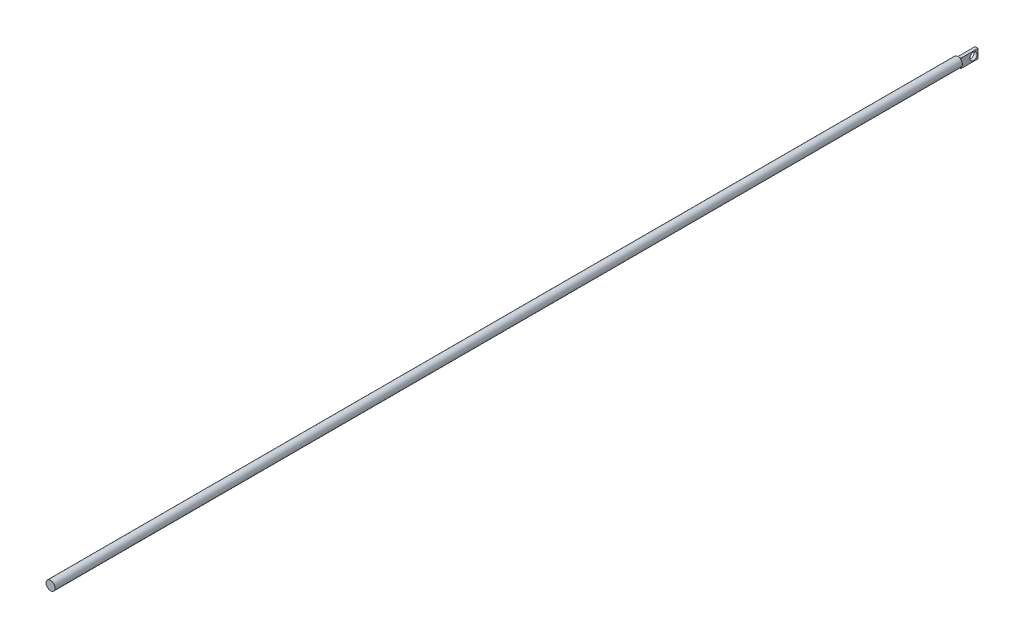
ISO-10303-21;
HEADER;
FILE_DESCRIPTION(('STEP AP214'),'2;1');
FILE_NAME('part.step','',(''),(''),'','','');
FILE_SCHEMA(('AUTOMOTIVE_DESIGN { 1 0 10303 214 1 1 1 1 }'));
ENDSEC;
DATA;
#1=APPLICATION_CONTEXT('core data for automotive mechanical design processes');
#2=APPLICATION_PROTOCOL_DEFINITION('international standard','automotive_design',2000,#1);
#3=PRODUCT_CONTEXT('',#1,'mechanical');
#4=PRODUCT('Part','Part','',(#3));
#5=PRODUCT_RELATED_PRODUCT_CATEGORY('part','',(#4));
#6=PRODUCT_DEFINITION_FORMATION('','',#4);
#7=PRODUCT_DEFINITION_CONTEXT('part definition',#1,'design');
#8=PRODUCT_DEFINITION('design','',#6,#7);
#9=PRODUCT_DEFINITION_SHAPE('','',#8);
#10=(LENGTH_UNIT() NAMED_UNIT(*) SI_UNIT(.MILLI.,.METRE.));
#11=(NAMED_UNIT(*) PLANE_ANGLE_UNIT() SI_UNIT($,.RADIAN.));
#12=(NAMED_UNIT(*) SI_UNIT($,.STERADIAN.) SOLID_ANGLE_UNIT());
#13=UNCERTAINTY_MEASURE_WITH_UNIT(LENGTH_MEASURE(1.E-05),#10,'distance_accuracy_value','');
#14=(GEOMETRIC_REPRESENTATION_CONTEXT(3) GLOBAL_UNCERTAINTY_ASSIGNED_CONTEXT((#13)) GLOBAL_UNIT_ASSIGNED_CONTEXT((#10,
#11,#12)) REPRESENTATION_CONTEXT('',''));
#15=CARTESIAN_POINT('',(0.,0.,0.));
#16=DIRECTION('',(0.,0.,1.));
#17=DIRECTION('',(1.,0.,0.));
#18=AXIS2_PLACEMENT_3D('',#15,#16,#17);
#19=CARTESIAN_POINT('',(5.,0.,0.));
#20=DIRECTION('',(1.,0.,0.));
#21=DIRECTION('',(0.,0.,-1.));
#22=AXIS2_PLACEMENT_3D('',#19,#20,#21);
#23=PLANE('',#22);
#24=DIRECTION('',(0.,-1.,0.));
#25=VECTOR('',#24,1.);
#26=CARTESIAN_POINT('',(5.,7.41500764249356,-0.050040016090637));
#27=LINE('',#26,#25);
#28=CARTESIAN_POINT('',(5.,7.41500764249356,-0.050040016090637));
#29=VERTEX_POINT('',#28);
#30=CARTESIAN_POINT('',(5.,-7.58499235750644,-0.0500400160906388));
#31=VERTEX_POINT('',#30);
#32=EDGE_CURVE('E99',#29,#31,#27,.T.);
#33=ORIENTED_EDGE('',*,*,#32,.T.);
#34=DIRECTION('',(0.,0.,-1.));
#35=VECTOR('',#34,1.);
#36=CARTESIAN_POINT('',(5.,-7.58499235750644,-0.0500400160906388));
#37=LINE('',#36,#35);
#38=CARTESIAN_POINT('',(5.,-7.58499235750644,-28.3632186152652));
#39=VERTEX_POINT('',#38);
#40=EDGE_CURVE('E94',#31,#39,#37,.T.);
#41=ORIENTED_EDGE('',*,*,#40,.T.);
#42=DIRECTION('',(0.,1.,0.));
#43=VECTOR('',#42,1.);
#44=CARTESIAN_POINT('',(5.,7.41500764249356,-28.3632186152652));
#45=LINE('',#44,#43);
#46=CARTESIAN_POINT('',(5.,7.41500764249356,-28.3632186152652));
#47=VERTEX_POINT('',#46);
#48=EDGE_CURVE('E97',#39,#47,#45,.T.);
#49=ORIENTED_EDGE('',*,*,#48,.T.);
#50=DIRECTION('',(0.,0.,1.));
#51=VECTOR('',#50,1.);
#52=CARTESIAN_POINT('',(5.,7.41500764249356,-0.050040016090637));
#53=LINE('',#52,#51);
#54=EDGE_CURVE('E64',#47,#29,#53,.T.);
#55=ORIENTED_EDGE('',*,*,#54,.T.);
#56=EDGE_LOOP('',(#33,#41,#49,#55));
#57=FACE_BOUND('',#56,.T.);
#58=CARTESIAN_POINT('',(5.,-0.289020276193807,-21.0732081841058));
#59=DIRECTION('',(1.,0.,0.));
#60=DIRECTION('',(0.,0.,-1.));
#61=AXIS2_PLACEMENT_3D('',#58,#59,#60);
#62=CIRCLE('',#61,6.);
#63=CARTESIAN_POINT('',(5.,-0.289020276193807,-27.0732081841058));
#64=VERTEX_POINT('',#63);
#65=EDGE_CURVE('E114',#64,#64,#62,.T.);
#66=ORIENTED_EDGE('',*,*,#65,.F.);
#67=EDGE_LOOP('',(#66));
#68=FACE_BOUND('',#67,.T.);
#69=ADVANCED_FACE('F47',(#57,#68),#23,.T.);
#70=CARTESIAN_POINT('',(0.,0.,0.));
#71=DIRECTION('',(1.,0.,0.));
#72=DIRECTION('',(0.,0.,-1.));
#73=AXIS2_PLACEMENT_3D('',#70,#71,#72);
#74=PLANE('',#73);
#75=DIRECTION('',(0.,-1.,0.));
#76=VECTOR('',#75,1.);
#77=CARTESIAN_POINT('',(0.,7.41500764249356,-0.050040016090637));
#78=LINE('',#77,#76);
#79=CARTESIAN_POINT('',(0.,7.41500764249356,-0.050040016090637));
#80=VERTEX_POINT('',#79);
#81=CARTESIAN_POINT('',(0.,-7.58499235750644,-0.0500400160906388));
#82=VERTEX_POINT('',#81);
#83=EDGE_CURVE('E111',#80,#82,#78,.T.);
#84=ORIENTED_EDGE('',*,*,#83,.F.);
#85=DIRECTION('',(0.,0.,1.));
#86=VECTOR('',#85,1.);
#87=CARTESIAN_POINT('',(0.,7.41500764249356,-0.050040016090637));
#88=LINE('',#87,#86);
#89=CARTESIAN_POINT('',(0.,7.41500764249356,-28.3632186152652));
#90=VERTEX_POINT('',#89);
#91=EDGE_CURVE('E87',#90,#80,#88,.T.);
#92=ORIENTED_EDGE('',*,*,#91,.F.);
#93=DIRECTION('',(0.,1.,0.));
#94=VECTOR('',#93,1.);
#95=CARTESIAN_POINT('',(0.,7.41500764249356,-28.3632186152652));
#96=LINE('',#95,#94);
#97=CARTESIAN_POINT('',(0.,-7.58499235750644,-28.3632186152652));
#98=VERTEX_POINT('',#97);
#99=EDGE_CURVE('E81',#98,#90,#96,.T.);
#100=ORIENTED_EDGE('',*,*,#99,.F.);
#101=DIRECTION('',(0.,0.,-1.));
#102=VECTOR('',#101,1.);
#103=CARTESIAN_POINT('',(0.,-7.58499235750644,-0.0500400160906388));
#104=LINE('',#103,#102);
#105=EDGE_CURVE('E103',#82,#98,#104,.T.);
#106=ORIENTED_EDGE('',*,*,#105,.F.);
#107=EDGE_LOOP('',(#84,#92,#100,#106));
#108=FACE_BOUND('',#107,.T.);
#109=CARTESIAN_POINT('',(0.,-0.289020276193807,-21.0732081841058));
#110=DIRECTION('',(1.,0.,0.));
#111=DIRECTION('',(0.,0.,-1.));
#112=AXIS2_PLACEMENT_3D('',#109,#110,#111);
#113=CIRCLE('',#112,6.);
#114=CARTESIAN_POINT('',(0.,-0.289020276193807,-27.0732081841058));
#115=VERTEX_POINT('',#114);
#116=EDGE_CURVE('E126',#115,#115,#113,.T.);
#117=ORIENTED_EDGE('',*,*,#116,.T.);
#118=EDGE_LOOP('',(#117));
#119=FACE_BOUND('',#118,.T.);
#120=ADVANCED_FACE('F122',(#108,#119),#74,.F.);
#121=CARTESIAN_POINT('',(5.,7.41500764249356,-0.050040016090637));
#122=DIRECTION('',(0.,0.,-1.));
#123=DIRECTION('',(0.,1.,0.));
#124=AXIS2_PLACEMENT_3D('',#121,#122,#123);
#125=PLANE('',#124);
#126=ORIENTED_EDGE('',*,*,#83,.T.);
#127=DIRECTION('',(-1.,0.,0.));
#128=VECTOR('',#127,1.);
#129=CARTESIAN_POINT('',(5.,-7.58499235750644,-0.0500400160906388));
#130=LINE('',#129,#128);
#131=EDGE_CURVE('E12',#31,#82,#130,.T.);
#132=ORIENTED_EDGE('',*,*,#131,.F.);
#133=ORIENTED_EDGE('',*,*,#32,.F.);
#134=DIRECTION('',(-1.,0.,0.));
#135=VECTOR('',#134,1.);
#136=CARTESIAN_POINT('',(5.,7.41500764249356,-0.050040016090637));
#137=LINE('',#136,#135);
#138=EDGE_CURVE('E107',#29,#80,#137,.T.);
#139=ORIENTED_EDGE('',*,*,#138,.T.);
#140=EDGE_LOOP('',(#126,#132,#133,#139));
#141=FACE_BOUND('',#140,.T.);
#142=ADVANCED_FACE('F49',(#141),#125,.F.);
#143=CARTESIAN_POINT('',(5.,-7.58499235750644,-0.0500400160906388));
#144=DIRECTION('',(0.,1.,0.));
#145=DIRECTION('',(0.,0.,1.));
#146=AXIS2_PLACEMENT_3D('',#143,#144,#145);
#147=PLANE('',#146);
#148=ORIENTED_EDGE('',*,*,#105,.T.);
#149=DIRECTION('',(-1.,0.,0.));
#150=VECTOR('',#149,1.);
#151=CARTESIAN_POINT('',(5.,-7.58499235750644,-28.3632186152652));
#152=LINE('',#151,#150);
#153=EDGE_CURVE('E56',#39,#98,#152,.T.);
#154=ORIENTED_EDGE('',*,*,#153,.F.);
#155=ORIENTED_EDGE('',*,*,#40,.F.);
#156=ORIENTED_EDGE('',*,*,#131,.T.);
#157=EDGE_LOOP('',(#148,#154,#155,#156));
#158=FACE_BOUND('',#157,.T.);
#159=ADVANCED_FACE('F102',(#158),#147,.F.);
#160=CARTESIAN_POINT('',(5.,7.41500764249356,-28.3632186152652));
#161=DIRECTION('',(0.,0.,1.));
#162=DIRECTION('',(0.,-1.,0.));
#163=AXIS2_PLACEMENT_3D('',#160,#161,#162);
#164=PLANE('',#163);
#165=ORIENTED_EDGE('',*,*,#99,.T.);
#166=DIRECTION('',(-1.,0.,0.));
#167=VECTOR('',#166,1.);
#168=CARTESIAN_POINT('',(5.,7.41500764249356,-28.3632186152652));
#169=LINE('',#168,#167);
#170=EDGE_CURVE('E104',#47,#90,#169,.T.);
#171=ORIENTED_EDGE('',*,*,#170,.F.);
#172=ORIENTED_EDGE('',*,*,#48,.F.);
#173=ORIENTED_EDGE('',*,*,#153,.T.);
#174=EDGE_LOOP('',(#165,#171,#172,#173));
#175=FACE_BOUND('',#174,.T.);
#176=ADVANCED_FACE('F105',(#175),#164,.F.);
#177=CARTESIAN_POINT('',(5.,7.41500764249356,-0.050040016090637));
#178=DIRECTION('',(0.,-1.,0.));
#179=DIRECTION('',(0.,0.,-1.));
#180=AXIS2_PLACEMENT_3D('',#177,#178,#179);
#181=PLANE('',#180);
#182=ORIENTED_EDGE('',*,*,#91,.T.);
#183=ORIENTED_EDGE('',*,*,#138,.F.);
#184=ORIENTED_EDGE('',*,*,#54,.F.);
#185=ORIENTED_EDGE('',*,*,#170,.T.);
#186=EDGE_LOOP('',(#182,#183,#184,#185));
#187=FACE_BOUND('',#186,.T.);
#188=ADVANCED_FACE('F119',(#187),#181,.F.);
#189=CARTESIAN_POINT('',(5.,-0.289020276193807,-21.0732081841058));
#190=DIRECTION('',(-1.,0.,0.));
#191=DIRECTION('',(0.,0.,1.));
#192=AXIS2_PLACEMENT_3D('',#189,#190,#191);
#193=CYLINDRICAL_SURFACE('',#192,6.);
#194=ORIENTED_EDGE('',*,*,#65,.T.);
#195=EDGE_LOOP('',(#194));
#196=FACE_BOUND('',#195,.T.);
#197=ORIENTED_EDGE('',*,*,#116,.F.);
#198=EDGE_LOOP('',(#197));
#199=FACE_BOUND('',#198,.T.);
#200=ADVANCED_FACE('F132',(#196,#199),#193,.F.);
#201=CLOSED_SHELL('',(#69,#120,#142,#159,#176,#188,#200));
#202=MANIFOLD_SOLID_BREP('B2',#201);
#203=CARTESIAN_POINT('',(0.,0.,1500.));
#204=DIRECTION('',(0.,0.,-1.));
#205=DIRECTION('',(-1.,0.,0.));
#206=AXIS2_PLACEMENT_3D('',#203,#204,#205);
#207=CYLINDRICAL_SURFACE('',#206,7.5);
#208=CARTESIAN_POINT('',(0.,0.,1500.));
#209=DIRECTION('',(0.,0.,1.));
#210=DIRECTION('',(1.,0.,0.));
#211=AXIS2_PLACEMENT_3D('',#208,#209,#210);
#212=CIRCLE('',#211,7.5);
#213=CARTESIAN_POINT('',(7.5,0.,1500.));
#214=VERTEX_POINT('',#213);
#215=EDGE_CURVE('E46',#214,#214,#212,.T.);
#216=ORIENTED_EDGE('',*,*,#215,.F.);
#217=EDGE_LOOP('',(#216));
#218=FACE_BOUND('',#217,.T.);
#219=CARTESIAN_POINT('',(0.,0.,0.));
#220=DIRECTION('',(0.,0.,1.));
#221=DIRECTION('',(1.,0.,0.));
#222=AXIS2_PLACEMENT_3D('',#219,#220,#221);
#223=CIRCLE('',#222,7.5);
#224=CARTESIAN_POINT('',(7.5,0.,0.));
#225=VERTEX_POINT('',#224);
#226=EDGE_CURVE('E195',#225,#225,#223,.T.);
#227=ORIENTED_EDGE('',*,*,#226,.T.);
#228=EDGE_LOOP('',(#227));
#229=FACE_BOUND('',#228,.T.);
#230=ADVANCED_FACE('F192',(#218,#229),#207,.T.);
#231=CARTESIAN_POINT('',(0.,0.,1500.));
#232=DIRECTION('',(0.,0.,1.));
#233=DIRECTION('',(1.,0.,0.));
#234=AXIS2_PLACEMENT_3D('',#231,#232,#233);
#235=PLANE('',#234);
#236=ORIENTED_EDGE('',*,*,#215,.T.);
#237=EDGE_LOOP('',(#236));
#238=FACE_BOUND('',#237,.T.);
#239=ADVANCED_FACE('F207',(#238),#235,.T.);
#240=CARTESIAN_POINT('',(0.,0.,0.));
#241=DIRECTION('',(0.,0.,1.));
#242=DIRECTION('',(1.,0.,0.));
#243=AXIS2_PLACEMENT_3D('',#240,#241,#242);
#244=PLANE('',#243);
#245=ORIENTED_EDGE('',*,*,#226,.F.);
#246=EDGE_LOOP('',(#245));
#247=FACE_BOUND('',#246,.T.);
#248=ADVANCED_FACE('F205',(#247),#244,.F.);
#249=CLOSED_SHELL('',(#230,#239,#248));
#250=MANIFOLD_SOLID_BREP('B6',#249);
#251=ADVANCED_BREP_SHAPE_REPRESENTATION('',(#18,#202,#250),#14);
#252=SHAPE_DEFINITION_REPRESENTATION(#9,#251);
ENDSEC;
END-ISO-10303-21;
